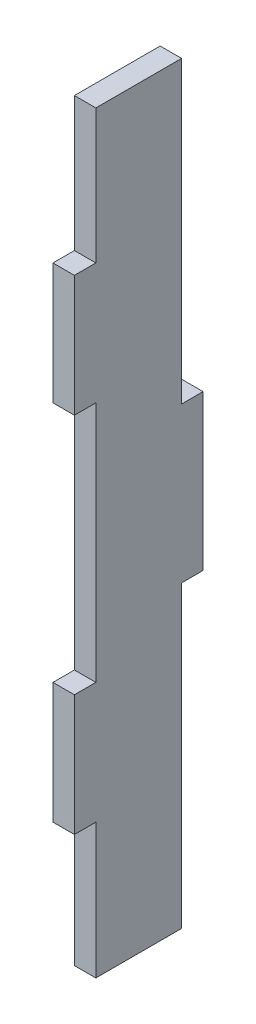
ISO-10303-21;
HEADER;
FILE_DESCRIPTION(('STEP AP214'),'2;1');
FILE_NAME('part.step','',(''),(''),'','','');
FILE_SCHEMA(('AUTOMOTIVE_DESIGN { 1 0 10303 214 1 1 1 1 }'));
ENDSEC;
DATA;
#1=APPLICATION_CONTEXT('core data for automotive mechanical design processes');
#2=APPLICATION_PROTOCOL_DEFINITION('international standard','automotive_design',2000,#1);
#3=PRODUCT_CONTEXT('',#1,'mechanical');
#4=PRODUCT('Part','Part','',(#3));
#5=PRODUCT_RELATED_PRODUCT_CATEGORY('part','',(#4));
#6=PRODUCT_DEFINITION_FORMATION('','',#4);
#7=PRODUCT_DEFINITION_CONTEXT('part definition',#1,'design');
#8=PRODUCT_DEFINITION('design','',#6,#7);
#9=PRODUCT_DEFINITION_SHAPE('','',#8);
#10=(LENGTH_UNIT() NAMED_UNIT(*) SI_UNIT(.MILLI.,.METRE.));
#11=(NAMED_UNIT(*) PLANE_ANGLE_UNIT() SI_UNIT($,.RADIAN.));
#12=(NAMED_UNIT(*) SI_UNIT($,.STERADIAN.) SOLID_ANGLE_UNIT());
#13=UNCERTAINTY_MEASURE_WITH_UNIT(LENGTH_MEASURE(1.E-05),#10,'distance_accuracy_value','');
#14=(GEOMETRIC_REPRESENTATION_CONTEXT(3) GLOBAL_UNCERTAINTY_ASSIGNED_CONTEXT((#13)) GLOBAL_UNIT_ASSIGNED_CONTEXT((#10,
#11,#12)) REPRESENTATION_CONTEXT('',''));
#15=CARTESIAN_POINT('',(0.,0.,0.));
#16=DIRECTION('',(0.,0.,1.));
#17=DIRECTION('',(1.,0.,0.));
#18=AXIS2_PLACEMENT_3D('',#15,#16,#17);
#19=CARTESIAN_POINT('',(3.,52.7,9.00000000000001));
#20=DIRECTION('',(0.,0.,-1.));
#21=DIRECTION('',(0.,1.,0.));
#22=AXIS2_PLACEMENT_3D('',#19,#20,#21);
#23=PLANE('',#22);
#24=DIRECTION('',(-1.,0.,0.));
#25=VECTOR('',#24,1.);
#26=CARTESIAN_POINT('',(3.,16.97,9.));
#27=LINE('',#26,#25);
#28=CARTESIAN_POINT('',(3.,16.97,9.));
#29=VERTEX_POINT('',#28);
#30=CARTESIAN_POINT('',(0.,16.97,9.));
#31=VERTEX_POINT('',#30);
#32=EDGE_CURVE('E230',#29,#31,#27,.T.);
#33=ORIENTED_EDGE('',*,*,#32,.F.);
#34=DIRECTION('',(0.,-1.,0.));
#35=VECTOR('',#34,1.);
#36=CARTESIAN_POINT('',(3.,52.7,9.00000000000001));
#37=LINE('',#36,#35);
#38=CARTESIAN_POINT('',(3.,33.92,9.));
#39=VERTEX_POINT('',#38);
#40=EDGE_CURVE('E41',#39,#29,#37,.T.);
#41=ORIENTED_EDGE('',*,*,#40,.F.);
#42=DIRECTION('',(-1.,0.,0.));
#43=VECTOR('',#42,1.);
#44=CARTESIAN_POINT('',(3.,33.92,9.));
#45=LINE('',#44,#43);
#46=CARTESIAN_POINT('',(0.,33.92,9.));
#47=VERTEX_POINT('',#46);
#48=EDGE_CURVE('E232',#39,#47,#45,.T.);
#49=ORIENTED_EDGE('',*,*,#48,.T.);
#50=DIRECTION('',(0.,-1.,0.));
#51=VECTOR('',#50,1.);
#52=CARTESIAN_POINT('',(0.,52.7,9.00000000000001));
#53=LINE('',#52,#51);
#54=EDGE_CURVE('E219',#47,#31,#53,.T.);
#55=ORIENTED_EDGE('',*,*,#54,.T.);
#56=EDGE_LOOP('',(#33,#41,#49,#55));
#57=FACE_BOUND('',#56,.T.);
#58=ADVANCED_FACE('F32',(#57),#23,.F.);
#59=CARTESIAN_POINT('',(0.,-16.89,9.));
#60=VERTEX_POINT('',#59);
#61=CARTESIAN_POINT('',(0.,-33.82,8.99999999999999));
#62=VERTEX_POINT('',#61);
#63=EDGE_CURVE('E217',#60,#62,#53,.T.);
#64=ORIENTED_EDGE('',*,*,#63,.T.);
#65=DIRECTION('',(-1.,0.,0.));
#66=VECTOR('',#65,1.);
#67=CARTESIAN_POINT('',(3.,-33.82,8.99999999999999));
#68=LINE('',#67,#66);
#69=CARTESIAN_POINT('',(3.,-33.82,8.99999999999999));
#70=VERTEX_POINT('',#69);
#71=EDGE_CURVE('E157',#70,#62,#68,.T.);
#72=ORIENTED_EDGE('',*,*,#71,.F.);
#73=CARTESIAN_POINT('',(3.,-16.89,9.));
#74=VERTEX_POINT('',#73);
#75=EDGE_CURVE('E214',#74,#70,#37,.T.);
#76=ORIENTED_EDGE('',*,*,#75,.F.);
#77=DIRECTION('',(-1.,0.,0.));
#78=VECTOR('',#77,1.);
#79=CARTESIAN_POINT('',(3.,-16.89,9.));
#80=LINE('',#79,#78);
#81=EDGE_CURVE('E253',#74,#60,#80,.T.);
#82=ORIENTED_EDGE('',*,*,#81,.T.);
#83=EDGE_LOOP('',(#64,#72,#76,#82));
#84=FACE_BOUND('',#83,.T.);
#85=ADVANCED_FACE('F310',(#84),#23,.F.);
#86=CARTESIAN_POINT('',(3.,-52.7,8.99999999999999));
#87=DIRECTION('',(0.,1.,0.));
#88=DIRECTION('',(0.,0.,1.));
#89=AXIS2_PLACEMENT_3D('',#86,#87,#88);
#90=PLANE('',#89);
#91=DIRECTION('',(-1.,0.,0.));
#92=VECTOR('',#91,1.);
#93=CARTESIAN_POINT('',(3.,-52.7,5.99999999999999));
#94=LINE('',#93,#92);
#95=CARTESIAN_POINT('',(3.,-52.7,5.99999999999999));
#96=VERTEX_POINT('',#95);
#97=CARTESIAN_POINT('',(0.,-52.7,5.99999999999999));
#98=VERTEX_POINT('',#97);
#99=EDGE_CURVE('E147',#96,#98,#94,.T.);
#100=ORIENTED_EDGE('',*,*,#99,.T.);
#101=DIRECTION('',(0.,0.,-1.));
#102=VECTOR('',#101,1.);
#103=CARTESIAN_POINT('',(0.,-52.7,8.99999999999999));
#104=LINE('',#103,#102);
#105=CARTESIAN_POINT('',(0.,-52.7,-6.00000000000001));
#106=VERTEX_POINT('',#105);
#107=EDGE_CURVE('E36',#98,#106,#104,.T.);
#108=ORIENTED_EDGE('',*,*,#107,.T.);
#109=DIRECTION('',(1.,0.,0.));
#110=VECTOR('',#109,1.);
#111=CARTESIAN_POINT('',(0.,-52.7,-6.00000000000001));
#112=LINE('',#111,#110);
#113=CARTESIAN_POINT('',(3.,-52.7,-6.00000000000001));
#114=VERTEX_POINT('',#113);
#115=EDGE_CURVE('E171',#106,#114,#112,.T.);
#116=ORIENTED_EDGE('',*,*,#115,.T.);
#117=DIRECTION('',(0.,0.,-1.));
#118=VECTOR('',#117,1.);
#119=CARTESIAN_POINT('',(3.,-52.7,8.99999999999999));
#120=LINE('',#119,#118);
#121=EDGE_CURVE('E11',#96,#114,#120,.T.);
#122=ORIENTED_EDGE('',*,*,#121,.F.);
#123=EDGE_LOOP('',(#100,#108,#116,#122));
#124=FACE_BOUND('',#123,.T.);
#125=ADVANCED_FACE('F169',(#124),#90,.F.);
#126=CARTESIAN_POINT('',(3.,0.,0.));
#127=DIRECTION('',(1.,0.,0.));
#128=DIRECTION('',(0.,0.,-1.));
#129=AXIS2_PLACEMENT_3D('',#126,#127,#128);
#130=PLANE('',#129);
#131=DIRECTION('',(0.,0.,-1.));
#132=VECTOR('',#131,1.);
#133=CARTESIAN_POINT('',(3.,-33.82,0.));
#134=LINE('',#133,#132);
#135=CARTESIAN_POINT('',(3.,-33.82,5.99999999999999));
#136=VERTEX_POINT('',#135);
#137=EDGE_CURVE('E158',#70,#136,#134,.T.);
#138=ORIENTED_EDGE('',*,*,#137,.T.);
#139=DIRECTION('',(0.,1.,0.));
#140=VECTOR('',#139,1.);
#141=CARTESIAN_POINT('',(3.,0.,5.99999999999999));
#142=LINE('',#141,#140);
#143=EDGE_CURVE('E150',#96,#136,#142,.T.);
#144=ORIENTED_EDGE('',*,*,#143,.F.);
#145=ORIENTED_EDGE('',*,*,#121,.T.);
#146=DIRECTION('',(0.,-1.,0.));
#147=VECTOR('',#146,1.);
#148=CARTESIAN_POINT('',(3.,-52.7,-6.00000000000001));
#149=LINE('',#148,#147);
#150=CARTESIAN_POINT('',(3.,-10.835,-6.00000000000001));
#151=VERTEX_POINT('',#150);
#152=EDGE_CURVE('E183',#151,#114,#149,.T.);
#153=ORIENTED_EDGE('',*,*,#152,.F.);
#154=DIRECTION('',(0.,0.,1.));
#155=VECTOR('',#154,1.);
#156=CARTESIAN_POINT('',(3.,-10.835,-9.00000000000001));
#157=LINE('',#156,#155);
#158=CARTESIAN_POINT('',(3.,-10.835,-9.00000000000001));
#159=VERTEX_POINT('',#158);
#160=EDGE_CURVE('E204',#159,#151,#157,.T.);
#161=ORIENTED_EDGE('',*,*,#160,.F.);
#162=DIRECTION('',(0.,1.,0.));
#163=VECTOR('',#162,1.);
#164=CARTESIAN_POINT('',(3.,52.7,-8.99999999999999));
#165=LINE('',#164,#163);
#166=CARTESIAN_POINT('',(3.,10.835,-9.));
#167=VERTEX_POINT('',#166);
#168=EDGE_CURVE('E208',#159,#167,#165,.T.);
#169=ORIENTED_EDGE('',*,*,#168,.T.);
#170=DIRECTION('',(0.,0.,-1.));
#171=VECTOR('',#170,1.);
#172=CARTESIAN_POINT('',(3.,10.835,-9.));
#173=LINE('',#172,#171);
#174=CARTESIAN_POINT('',(3.,10.835,-6.));
#175=VERTEX_POINT('',#174);
#176=EDGE_CURVE('E192',#175,#167,#173,.T.);
#177=ORIENTED_EDGE('',*,*,#176,.F.);
#178=DIRECTION('',(0.,-1.,0.));
#179=VECTOR('',#178,1.);
#180=CARTESIAN_POINT('',(3.,52.7,-5.99999999999999));
#181=LINE('',#180,#179);
#182=CARTESIAN_POINT('',(3.,52.7,-5.99999999999999));
#183=VERTEX_POINT('',#182);
#184=EDGE_CURVE('E196',#183,#175,#181,.T.);
#185=ORIENTED_EDGE('',*,*,#184,.F.);
#186=DIRECTION('',(0.,0.,1.));
#187=VECTOR('',#186,1.);
#188=CARTESIAN_POINT('',(3.,52.7,9.00000000000001));
#189=LINE('',#188,#187);
#190=CARTESIAN_POINT('',(3.,52.7,6.));
#191=VERTEX_POINT('',#190);
#192=EDGE_CURVE('E211',#183,#191,#189,.T.);
#193=ORIENTED_EDGE('',*,*,#192,.T.);
#194=DIRECTION('',(0.,-1.,0.));
#195=VECTOR('',#194,1.);
#196=CARTESIAN_POINT('',(3.,0.,6.00000000000001));
#197=LINE('',#196,#195);
#198=CARTESIAN_POINT('',(3.,33.92,6.00000000000001));
#199=VERTEX_POINT('',#198);
#200=EDGE_CURVE('E259',#191,#199,#197,.T.);
#201=ORIENTED_EDGE('',*,*,#200,.T.);
#202=DIRECTION('',(0.,0.,-1.));
#203=VECTOR('',#202,1.);
#204=CARTESIAN_POINT('',(3.,33.92,0.));
#205=LINE('',#204,#203);
#206=EDGE_CURVE('E262',#39,#199,#205,.T.);
#207=ORIENTED_EDGE('',*,*,#206,.F.);
#208=ORIENTED_EDGE('',*,*,#40,.T.);
#209=DIRECTION('',(0.,0.,1.));
#210=VECTOR('',#209,1.);
#211=CARTESIAN_POINT('',(3.,16.97,0.));
#212=LINE('',#211,#210);
#213=CARTESIAN_POINT('',(3.,16.97,6.00000000000001));
#214=VERTEX_POINT('',#213);
#215=EDGE_CURVE('E251',#214,#29,#212,.T.);
#216=ORIENTED_EDGE('',*,*,#215,.F.);
#217=DIRECTION('',(0.,1.,0.));
#218=VECTOR('',#217,1.);
#219=CARTESIAN_POINT('',(3.,0.,6.00000000000001));
#220=LINE('',#219,#218);
#221=CARTESIAN_POINT('',(3.,-16.89,6.00000000000001));
#222=VERTEX_POINT('',#221);
#223=EDGE_CURVE('E442',#222,#214,#220,.T.);
#224=ORIENTED_EDGE('',*,*,#223,.F.);
#225=DIRECTION('',(0.,0.,1.));
#226=VECTOR('',#225,1.);
#227=CARTESIAN_POINT('',(3.,-16.89,0.));
#228=LINE('',#227,#226);
#229=EDGE_CURVE('E247',#222,#74,#228,.T.);
#230=ORIENTED_EDGE('',*,*,#229,.T.);
#231=ORIENTED_EDGE('',*,*,#75,.T.);
#232=EDGE_LOOP('',(#138,#144,#145,#153,#161,#169,#177,#185,#193,#201,#207,#208,#216,#224,#230,#231));
#233=FACE_BOUND('',#232,.T.);
#234=ADVANCED_FACE('F162',(#233),#130,.T.);
#235=CARTESIAN_POINT('',(0.,0.,0.));
#236=DIRECTION('',(1.,0.,0.));
#237=DIRECTION('',(0.,0.,-1.));
#238=AXIS2_PLACEMENT_3D('',#235,#236,#237);
#239=PLANE('',#238);
#240=DIRECTION('',(0.,1.,0.));
#241=VECTOR('',#240,1.);
#242=CARTESIAN_POINT('',(0.,0.,5.99999999999999));
#243=LINE('',#242,#241);
#244=CARTESIAN_POINT('',(0.,-33.82,5.99999999999999));
#245=VERTEX_POINT('',#244);
#246=EDGE_CURVE('E153',#98,#245,#243,.T.);
#247=ORIENTED_EDGE('',*,*,#246,.T.);
#248=DIRECTION('',(0.,0.,-1.));
#249=VECTOR('',#248,1.);
#250=CARTESIAN_POINT('',(0.,-33.82,0.));
#251=LINE('',#250,#249);
#252=EDGE_CURVE('E166',#62,#245,#251,.T.);
#253=ORIENTED_EDGE('',*,*,#252,.F.);
#254=ORIENTED_EDGE('',*,*,#63,.F.);
#255=DIRECTION('',(0.,0.,1.));
#256=VECTOR('',#255,1.);
#257=CARTESIAN_POINT('',(0.,-16.89,0.));
#258=LINE('',#257,#256);
#259=CARTESIAN_POINT('',(0.,-16.89,6.00000000000001));
#260=VERTEX_POINT('',#259);
#261=EDGE_CURVE('E242',#260,#60,#258,.T.);
#262=ORIENTED_EDGE('',*,*,#261,.F.);
#263=DIRECTION('',(0.,1.,0.));
#264=VECTOR('',#263,1.);
#265=CARTESIAN_POINT('',(0.,0.,6.00000000000001));
#266=LINE('',#265,#264);
#267=CARTESIAN_POINT('',(0.,16.97,6.00000000000001));
#268=VERTEX_POINT('',#267);
#269=EDGE_CURVE('E240',#260,#268,#266,.T.);
#270=ORIENTED_EDGE('',*,*,#269,.T.);
#271=DIRECTION('',(0.,0.,1.));
#272=VECTOR('',#271,1.);
#273=CARTESIAN_POINT('',(0.,16.97,0.));
#274=LINE('',#273,#272);
#275=EDGE_CURVE('E49',#268,#31,#274,.T.);
#276=ORIENTED_EDGE('',*,*,#275,.T.);
#277=ORIENTED_EDGE('',*,*,#54,.F.);
#278=DIRECTION('',(0.,0.,-1.));
#279=VECTOR('',#278,1.);
#280=CARTESIAN_POINT('',(0.,33.92,0.));
#281=LINE('',#280,#279);
#282=CARTESIAN_POINT('',(0.,33.92,6.00000000000001));
#283=VERTEX_POINT('',#282);
#284=EDGE_CURVE('E236',#47,#283,#281,.T.);
#285=ORIENTED_EDGE('',*,*,#284,.T.);
#286=DIRECTION('',(0.,-1.,0.));
#287=VECTOR('',#286,1.);
#288=CARTESIAN_POINT('',(0.,0.,6.00000000000001));
#289=LINE('',#288,#287);
#290=CARTESIAN_POINT('',(0.,52.7,6.00000000000001));
#291=VERTEX_POINT('',#290);
#292=EDGE_CURVE('E264',#291,#283,#289,.T.);
#293=ORIENTED_EDGE('',*,*,#292,.F.);
#294=DIRECTION('',(0.,0.,1.));
#295=VECTOR('',#294,1.);
#296=CARTESIAN_POINT('',(0.,52.7,9.00000000000001));
#297=LINE('',#296,#295);
#298=CARTESIAN_POINT('',(0.,52.7,-5.99999999999999));
#299=VERTEX_POINT('',#298);
#300=EDGE_CURVE('E178',#299,#291,#297,.T.);
#301=ORIENTED_EDGE('',*,*,#300,.F.);
#302=DIRECTION('',(0.,-1.,0.));
#303=VECTOR('',#302,1.);
#304=CARTESIAN_POINT('',(0.,52.7,-5.99999999999999));
#305=LINE('',#304,#303);
#306=CARTESIAN_POINT('',(0.,10.835,-6.));
#307=VERTEX_POINT('',#306);
#308=EDGE_CURVE('E188',#299,#307,#305,.T.);
#309=ORIENTED_EDGE('',*,*,#308,.T.);
#310=DIRECTION('',(0.,0.,-1.));
#311=VECTOR('',#310,1.);
#312=CARTESIAN_POINT('',(0.,10.835,-9.));
#313=LINE('',#312,#311);
#314=CARTESIAN_POINT('',(0.,10.835,-9.));
#315=VERTEX_POINT('',#314);
#316=EDGE_CURVE('E191',#307,#315,#313,.T.);
#317=ORIENTED_EDGE('',*,*,#316,.T.);
#318=DIRECTION('',(0.,1.,0.));
#319=VECTOR('',#318,1.);
#320=CARTESIAN_POINT('',(0.,52.7,-8.99999999999999));
#321=LINE('',#320,#319);
#322=CARTESIAN_POINT('',(0.,-10.835,-9.00000000000001));
#323=VERTEX_POINT('',#322);
#324=EDGE_CURVE('E174',#323,#315,#321,.T.);
#325=ORIENTED_EDGE('',*,*,#324,.F.);
#326=DIRECTION('',(0.,0.,1.));
#327=VECTOR('',#326,1.);
#328=CARTESIAN_POINT('',(0.,-10.835,-9.00000000000001));
#329=LINE('',#328,#327);
#330=CARTESIAN_POINT('',(0.,-10.835,-6.00000000000001));
#331=VERTEX_POINT('',#330);
#332=EDGE_CURVE('E269',#323,#331,#329,.T.);
#333=ORIENTED_EDGE('',*,*,#332,.T.);
#334=DIRECTION('',(0.,-1.,0.));
#335=VECTOR('',#334,1.);
#336=CARTESIAN_POINT('',(0.,-52.7,-6.00000000000001));
#337=LINE('',#336,#335);
#338=EDGE_CURVE('E187',#331,#106,#337,.T.);
#339=ORIENTED_EDGE('',*,*,#338,.T.);
#340=ORIENTED_EDGE('',*,*,#107,.F.);
#341=EDGE_LOOP('',(#247,#253,#254,#262,#270,#276,#277,#285,#293,#301,#309,#317,#325,#333,#339,#340));
#342=FACE_BOUND('',#341,.T.);
#343=ADVANCED_FACE('F235',(#342),#239,.F.);
#344=CARTESIAN_POINT('',(3.,52.7,-8.99999999999999));
#345=DIRECTION('',(0.,0.,1.));
#346=DIRECTION('',(0.,-1.,0.));
#347=AXIS2_PLACEMENT_3D('',#344,#345,#346);
#348=PLANE('',#347);
#349=ORIENTED_EDGE('',*,*,#168,.F.);
#350=DIRECTION('',(1.,0.,0.));
#351=VECTOR('',#350,1.);
#352=CARTESIAN_POINT('',(0.,-10.835,-9.00000000000001));
#353=LINE('',#352,#351);
#354=EDGE_CURVE('E180',#323,#159,#353,.T.);
#355=ORIENTED_EDGE('',*,*,#354,.F.);
#356=ORIENTED_EDGE('',*,*,#324,.T.);
#357=DIRECTION('',(1.,0.,0.));
#358=VECTOR('',#357,1.);
#359=CARTESIAN_POINT('',(0.,10.835,-9.));
#360=LINE('',#359,#358);
#361=EDGE_CURVE('E201',#315,#167,#360,.T.);
#362=ORIENTED_EDGE('',*,*,#361,.T.);
#363=EDGE_LOOP('',(#349,#355,#356,#362));
#364=FACE_BOUND('',#363,.T.);
#365=ADVANCED_FACE('F34',(#364),#348,.F.);
#366=CARTESIAN_POINT('',(3.,52.7,9.00000000000001));
#367=DIRECTION('',(0.,-1.,0.));
#368=DIRECTION('',(0.,0.,-1.));
#369=AXIS2_PLACEMENT_3D('',#366,#367,#368);
#370=PLANE('',#369);
#371=ORIENTED_EDGE('',*,*,#300,.T.);
#372=DIRECTION('',(-1.,0.,0.));
#373=VECTOR('',#372,1.);
#374=CARTESIAN_POINT('',(3.,52.7,6.));
#375=LINE('',#374,#373);
#376=EDGE_CURVE('E57',#191,#291,#375,.T.);
#377=ORIENTED_EDGE('',*,*,#376,.F.);
#378=ORIENTED_EDGE('',*,*,#192,.F.);
#379=DIRECTION('',(1.,0.,0.));
#380=VECTOR('',#379,1.);
#381=CARTESIAN_POINT('',(0.,52.7,-5.99999999999999));
#382=LINE('',#381,#380);
#383=EDGE_CURVE('E195',#299,#183,#382,.T.);
#384=ORIENTED_EDGE('',*,*,#383,.F.);
#385=EDGE_LOOP('',(#371,#377,#378,#384));
#386=FACE_BOUND('',#385,.T.);
#387=ADVANCED_FACE('F292',(#386),#370,.F.);
#388=CARTESIAN_POINT('',(0.,10.835,-9.));
#389=DIRECTION('',(0.,-1.,0.));
#390=DIRECTION('',(0.,0.,-1.));
#391=AXIS2_PLACEMENT_3D('',#388,#389,#390);
#392=PLANE('',#391);
#393=ORIENTED_EDGE('',*,*,#176,.T.);
#394=ORIENTED_EDGE('',*,*,#361,.F.);
#395=ORIENTED_EDGE('',*,*,#316,.F.);
#396=DIRECTION('',(1.,0.,0.));
#397=VECTOR('',#396,1.);
#398=CARTESIAN_POINT('',(0.,10.835,-6.));
#399=LINE('',#398,#397);
#400=EDGE_CURVE('E205',#307,#175,#399,.T.);
#401=ORIENTED_EDGE('',*,*,#400,.T.);
#402=EDGE_LOOP('',(#393,#394,#395,#401));
#403=FACE_BOUND('',#402,.T.);
#404=ADVANCED_FACE('F283',(#403),#392,.F.);
#405=CARTESIAN_POINT('',(0.,52.7,-5.99999999999999));
#406=DIRECTION('',(0.,0.,1.));
#407=DIRECTION('',(0.,-1.,0.));
#408=AXIS2_PLACEMENT_3D('',#405,#406,#407);
#409=PLANE('',#408);
#410=ORIENTED_EDGE('',*,*,#184,.T.);
#411=ORIENTED_EDGE('',*,*,#400,.F.);
#412=ORIENTED_EDGE('',*,*,#308,.F.);
#413=ORIENTED_EDGE('',*,*,#383,.T.);
#414=EDGE_LOOP('',(#410,#411,#412,#413));
#415=FACE_BOUND('',#414,.T.);
#416=ADVANCED_FACE('F288',(#415),#409,.F.);
#417=CARTESIAN_POINT('',(0.,-52.7,-6.00000000000001));
#418=DIRECTION('',(0.,0.,1.));
#419=DIRECTION('',(1.,0.,0.));
#420=AXIS2_PLACEMENT_3D('',#417,#418,#419);
#421=PLANE('',#420);
#422=ORIENTED_EDGE('',*,*,#152,.T.);
#423=ORIENTED_EDGE('',*,*,#115,.F.);
#424=ORIENTED_EDGE('',*,*,#338,.F.);
#425=DIRECTION('',(1.,0.,0.));
#426=VECTOR('',#425,1.);
#427=CARTESIAN_POINT('',(0.,-10.835,-6.00000000000001));
#428=LINE('',#427,#426);
#429=EDGE_CURVE('E175',#331,#151,#428,.T.);
#430=ORIENTED_EDGE('',*,*,#429,.T.);
#431=EDGE_LOOP('',(#422,#423,#424,#430));
#432=FACE_BOUND('',#431,.T.);
#433=ADVANCED_FACE('F276',(#432),#421,.F.);
#434=CARTESIAN_POINT('',(0.,-10.835,-9.00000000000001));
#435=DIRECTION('',(0.,1.,0.));
#436=DIRECTION('',(0.,0.,1.));
#437=AXIS2_PLACEMENT_3D('',#434,#435,#436);
#438=PLANE('',#437);
#439=ORIENTED_EDGE('',*,*,#160,.T.);
#440=ORIENTED_EDGE('',*,*,#429,.F.);
#441=ORIENTED_EDGE('',*,*,#332,.F.);
#442=ORIENTED_EDGE('',*,*,#354,.T.);
#443=EDGE_LOOP('',(#439,#440,#441,#442));
#444=FACE_BOUND('',#443,.T.);
#445=ADVANCED_FACE('F299',(#444),#438,.F.);
#446=CARTESIAN_POINT('',(3.,33.92,0.));
#447=DIRECTION('',(0.,1.,0.));
#448=DIRECTION('',(0.,0.,1.));
#449=AXIS2_PLACEMENT_3D('',#446,#447,#448);
#450=PLANE('',#449);
#451=ORIENTED_EDGE('',*,*,#284,.F.);
#452=ORIENTED_EDGE('',*,*,#48,.F.);
#453=ORIENTED_EDGE('',*,*,#206,.T.);
#454=DIRECTION('',(-1.,0.,0.));
#455=VECTOR('',#454,1.);
#456=CARTESIAN_POINT('',(3.,33.92,6.00000000000001));
#457=LINE('',#456,#455);
#458=EDGE_CURVE('E244',#199,#283,#457,.T.);
#459=ORIENTED_EDGE('',*,*,#458,.T.);
#460=EDGE_LOOP('',(#451,#452,#453,#459));
#461=FACE_BOUND('',#460,.T.);
#462=ADVANCED_FACE('F297',(#461),#450,.T.);
#463=CARTESIAN_POINT('',(3.,0.,6.00000000000001));
#464=DIRECTION('',(0.,0.,-1.));
#465=DIRECTION('',(0.,1.,0.));
#466=AXIS2_PLACEMENT_3D('',#463,#464,#465);
#467=PLANE('',#466);
#468=ORIENTED_EDGE('',*,*,#292,.T.);
#469=ORIENTED_EDGE('',*,*,#458,.F.);
#470=ORIENTED_EDGE('',*,*,#200,.F.);
#471=ORIENTED_EDGE('',*,*,#376,.T.);
#472=EDGE_LOOP('',(#468,#469,#470,#471));
#473=FACE_BOUND('',#472,.T.);
#474=ADVANCED_FACE('F295',(#473),#467,.F.);
#475=CARTESIAN_POINT('',(3.,16.97,0.));
#476=DIRECTION('',(0.,-1.,0.));
#477=DIRECTION('',(0.,0.,-1.));
#478=AXIS2_PLACEMENT_3D('',#475,#476,#477);
#479=PLANE('',#478);
#480=ORIENTED_EDGE('',*,*,#275,.F.);
#481=DIRECTION('',(-1.,0.,0.));
#482=VECTOR('',#481,1.);
#483=CARTESIAN_POINT('',(3.,16.97,6.00000000000001));
#484=LINE('',#483,#482);
#485=EDGE_CURVE('E257',#214,#268,#484,.T.);
#486=ORIENTED_EDGE('',*,*,#485,.F.);
#487=ORIENTED_EDGE('',*,*,#215,.T.);
#488=ORIENTED_EDGE('',*,*,#32,.T.);
#489=EDGE_LOOP('',(#480,#486,#487,#488));
#490=FACE_BOUND('',#489,.T.);
#491=ADVANCED_FACE('F305',(#490),#479,.T.);
#492=CARTESIAN_POINT('',(3.,-16.89,0.));
#493=DIRECTION('',(0.,-1.,0.));
#494=DIRECTION('',(0.,0.,-1.));
#495=AXIS2_PLACEMENT_3D('',#492,#493,#494);
#496=PLANE('',#495);
#497=ORIENTED_EDGE('',*,*,#261,.T.);
#498=ORIENTED_EDGE('',*,*,#81,.F.);
#499=ORIENTED_EDGE('',*,*,#229,.F.);
#500=DIRECTION('',(-1.,0.,0.));
#501=VECTOR('',#500,1.);
#502=CARTESIAN_POINT('',(3.,-16.89,6.00000000000001));
#503=LINE('',#502,#501);
#504=EDGE_CURVE('E255',#222,#260,#503,.T.);
#505=ORIENTED_EDGE('',*,*,#504,.T.);
#506=EDGE_LOOP('',(#497,#498,#499,#505));
#507=FACE_BOUND('',#506,.T.);
#508=ADVANCED_FACE('F394',(#507),#496,.F.);
#509=CARTESIAN_POINT('',(3.,0.,6.00000000000001));
#510=DIRECTION('',(0.,0.,1.));
#511=DIRECTION('',(1.,0.,0.));
#512=AXIS2_PLACEMENT_3D('',#509,#510,#511);
#513=PLANE('',#512);
#514=ORIENTED_EDGE('',*,*,#269,.F.);
#515=ORIENTED_EDGE('',*,*,#504,.F.);
#516=ORIENTED_EDGE('',*,*,#223,.T.);
#517=ORIENTED_EDGE('',*,*,#485,.T.);
#518=EDGE_LOOP('',(#514,#515,#516,#517));
#519=FACE_BOUND('',#518,.T.);
#520=ADVANCED_FACE('F402',(#519),#513,.T.);
#521=CARTESIAN_POINT('',(3.,0.,5.99999999999999));
#522=DIRECTION('',(0.,0.,1.));
#523=DIRECTION('',(0.,-1.,0.));
#524=AXIS2_PLACEMENT_3D('',#521,#522,#523);
#525=PLANE('',#524);
#526=ORIENTED_EDGE('',*,*,#246,.F.);
#527=ORIENTED_EDGE('',*,*,#99,.F.);
#528=ORIENTED_EDGE('',*,*,#143,.T.);
#529=DIRECTION('',(-1.,0.,0.));
#530=VECTOR('',#529,1.);
#531=CARTESIAN_POINT('',(3.,-33.82,5.99999999999999));
#532=LINE('',#531,#530);
#533=EDGE_CURVE('E199',#136,#245,#532,.T.);
#534=ORIENTED_EDGE('',*,*,#533,.T.);
#535=EDGE_LOOP('',(#526,#527,#528,#534));
#536=FACE_BOUND('',#535,.T.);
#537=ADVANCED_FACE('F149',(#536),#525,.T.);
#538=CARTESIAN_POINT('',(3.,-33.82,0.));
#539=DIRECTION('',(0.,1.,0.));
#540=DIRECTION('',(0.,0.,1.));
#541=AXIS2_PLACEMENT_3D('',#538,#539,#540);
#542=PLANE('',#541);
#543=ORIENTED_EDGE('',*,*,#252,.T.);
#544=ORIENTED_EDGE('',*,*,#533,.F.);
#545=ORIENTED_EDGE('',*,*,#137,.F.);
#546=ORIENTED_EDGE('',*,*,#71,.T.);
#547=EDGE_LOOP('',(#543,#544,#545,#546));
#548=FACE_BOUND('',#547,.T.);
#549=ADVANCED_FACE('F421',(#548),#542,.F.);
#550=CLOSED_SHELL('',(#58,#85,#125,#234,#343,#365,#387,#404,#416,#433,#445,#462,#474,#491,#508,
#520,#537,#549));
#551=MANIFOLD_SOLID_BREP('B2',#550);
#552=ADVANCED_BREP_SHAPE_REPRESENTATION('',(#18,#551),#14);
#553=SHAPE_DEFINITION_REPRESENTATION(#9,#552);
ENDSEC;
END-ISO-10303-21;
